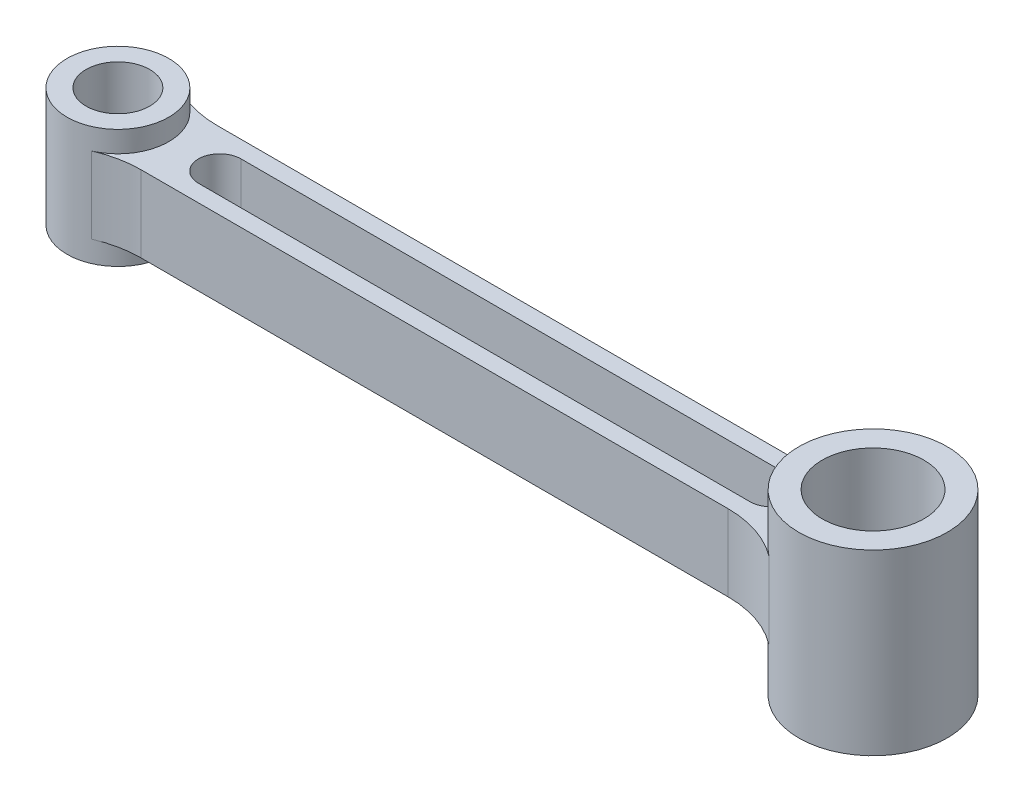
ISO-10303-21;
HEADER;
FILE_DESCRIPTION(('STEP AP214'),'2;1');
FILE_NAME('part.step','',(''),(''),'','','');
FILE_SCHEMA(('AUTOMOTIVE_DESIGN { 1 0 10303 214 1 1 1 1 }'));
ENDSEC;
DATA;
#1=APPLICATION_CONTEXT('core data for automotive mechanical design processes');
#2=APPLICATION_PROTOCOL_DEFINITION('international standard','automotive_design',2000,#1);
#3=PRODUCT_CONTEXT('',#1,'mechanical');
#4=PRODUCT('Part','Part','',(#3));
#5=PRODUCT_RELATED_PRODUCT_CATEGORY('part','',(#4));
#6=PRODUCT_DEFINITION_FORMATION('','',#4);
#7=PRODUCT_DEFINITION_CONTEXT('part definition',#1,'design');
#8=PRODUCT_DEFINITION('design','',#6,#7);
#9=PRODUCT_DEFINITION_SHAPE('','',#8);
#10=(LENGTH_UNIT() NAMED_UNIT(*) SI_UNIT(.MILLI.,.METRE.));
#11=(NAMED_UNIT(*) PLANE_ANGLE_UNIT() SI_UNIT($,.RADIAN.));
#12=(NAMED_UNIT(*) SI_UNIT($,.STERADIAN.) SOLID_ANGLE_UNIT());
#13=UNCERTAINTY_MEASURE_WITH_UNIT(LENGTH_MEASURE(1.E-05),#10,'distance_accuracy_value','');
#14=(GEOMETRIC_REPRESENTATION_CONTEXT(3) GLOBAL_UNCERTAINTY_ASSIGNED_CONTEXT((#13)) GLOBAL_UNIT_ASSIGNED_CONTEXT((#10,
#11,#12)) REPRESENTATION_CONTEXT('',''));
#15=CARTESIAN_POINT('',(0.,0.,0.));
#16=DIRECTION('',(0.,0.,1.));
#17=DIRECTION('',(1.,0.,0.));
#18=AXIS2_PLACEMENT_3D('',#15,#16,#17);
#19=CARTESIAN_POINT('',(-89.,14.,0.));
#20=DIRECTION('',(0.,-1.,0.));
#21=DIRECTION('',(0.,0.,-1.));
#22=AXIS2_PLACEMENT_3D('',#19,#20,#21);
#23=CYLINDRICAL_SURFACE('',#22,7.50000000000001);
#24=CARTESIAN_POINT('',(-89.,14.,0.));
#25=DIRECTION('',(0.,1.,0.));
#26=DIRECTION('',(0.,0.,1.));
#27=AXIS2_PLACEMENT_3D('',#24,#25,#26);
#28=CIRCLE('',#27,7.50000000000001);
#29=CARTESIAN_POINT('',(-89.,14.,7.50000000000001));
#30=VERTEX_POINT('',#29);
#31=EDGE_CURVE('E12',#30,#30,#28,.T.);
#32=ORIENTED_EDGE('',*,*,#31,.T.);
#33=EDGE_LOOP('',(#32));
#34=FACE_BOUND('',#33,.T.);
#35=CARTESIAN_POINT('',(-89.,-14.,0.));
#36=DIRECTION('',(0.,1.,0.));
#37=DIRECTION('',(0.,0.,1.));
#38=AXIS2_PLACEMENT_3D('',#35,#36,#37);
#39=CIRCLE('',#38,7.50000000000001);
#40=CARTESIAN_POINT('',(-89.,-14.,7.50000000000001));
#41=VERTEX_POINT('',#40);
#42=EDGE_CURVE('E60',#41,#41,#39,.T.);
#43=ORIENTED_EDGE('',*,*,#42,.F.);
#44=EDGE_LOOP('',(#43));
#45=FACE_BOUND('',#44,.T.);
#46=ADVANCED_FACE('F56',(#34,#45),#23,.F.);
#47=CARTESIAN_POINT('',(0.,-14.,0.));
#48=DIRECTION('',(0.,1.,0.));
#49=DIRECTION('',(0.,0.,1.));
#50=AXIS2_PLACEMENT_3D('',#47,#48,#49);
#51=PLANE('',#50);
#52=CARTESIAN_POINT('',(-89.,-14.,0.));
#53=DIRECTION('',(0.,1.,0.));
#54=DIRECTION('',(0.,0.,1.));
#55=AXIS2_PLACEMENT_3D('',#52,#53,#54);
#56=CIRCLE('',#55,12.);
#57=CARTESIAN_POINT('',(-89.,-14.,12.));
#58=VERTEX_POINT('',#57);
#59=EDGE_CURVE('E256',#58,#58,#56,.T.);
#60=ORIENTED_EDGE('',*,*,#59,.F.);
#61=EDGE_LOOP('',(#60));
#62=FACE_BOUND('',#61,.T.);
#63=ORIENTED_EDGE('',*,*,#42,.T.);
#64=EDGE_LOOP('',(#63));
#65=FACE_BOUND('',#64,.T.);
#66=ADVANCED_FACE('F264',(#62,#65),#51,.F.);
#67=CARTESIAN_POINT('',(-89.,14.,0.));
#68=DIRECTION('',(0.,-1.,0.));
#69=DIRECTION('',(0.,0.,-1.));
#70=AXIS2_PLACEMENT_3D('',#67,#68,#69);
#71=CYLINDRICAL_SURFACE('',#70,12.);
#72=DIRECTION('',(0.,-1.,0.));
#73=VECTOR('',#72,1.);
#74=CARTESIAN_POINT('',(-84.2041684766873,9.,11.));
#75=LINE('',#74,#73);
#76=CARTESIAN_POINT('',(-84.2041684766873,9.,11.));
#77=VERTEX_POINT('',#76);
#78=CARTESIAN_POINT('',(-84.2041684766873,-9.,11.));
#79=VERTEX_POINT('',#78);
#80=EDGE_CURVE('E253',#77,#79,#75,.T.);
#81=ORIENTED_EDGE('',*,*,#80,.F.);
#82=CARTESIAN_POINT('',(-89.,9.,0.));
#83=DIRECTION('',(0.,1.,0.));
#84=DIRECTION('',(0.,0.,1.));
#85=AXIS2_PLACEMENT_3D('',#82,#83,#84);
#86=CIRCLE('',#85,12.);
#87=CARTESIAN_POINT('',(-84.2041684766873,9.,-11.));
#88=VERTEX_POINT('',#87);
#89=EDGE_CURVE('E196',#77,#88,#86,.T.);
#90=ORIENTED_EDGE('',*,*,#89,.T.);
#91=DIRECTION('',(0.,-1.,0.));
#92=VECTOR('',#91,1.);
#93=CARTESIAN_POINT('',(-84.2041684766873,9.,-11.));
#94=LINE('',#93,#92);
#95=CARTESIAN_POINT('',(-84.2041684766873,-9.,-11.));
#96=VERTEX_POINT('',#95);
#97=EDGE_CURVE('E216',#88,#96,#94,.T.);
#98=ORIENTED_EDGE('',*,*,#97,.T.);
#99=CARTESIAN_POINT('',(-89.,-9.,0.));
#100=DIRECTION('',(0.,1.,0.));
#101=DIRECTION('',(0.,0.,1.));
#102=AXIS2_PLACEMENT_3D('',#99,#100,#101);
#103=CIRCLE('',#102,12.);
#104=EDGE_CURVE('E191',#79,#96,#103,.T.);
#105=ORIENTED_EDGE('',*,*,#104,.F.);
#106=EDGE_LOOP('',(#81,#90,#98,#105));
#107=FACE_BOUND('',#106,.T.);
#108=CARTESIAN_POINT('',(-89.,14.,0.));
#109=DIRECTION('',(0.,1.,0.));
#110=DIRECTION('',(0.,0.,1.));
#111=AXIS2_PLACEMENT_3D('',#108,#109,#110);
#112=CIRCLE('',#111,12.);
#113=CARTESIAN_POINT('',(-89.,14.,12.));
#114=VERTEX_POINT('',#113);
#115=EDGE_CURVE('E65',#114,#114,#112,.T.);
#116=ORIENTED_EDGE('',*,*,#115,.F.);
#117=EDGE_LOOP('',(#116));
#118=FACE_BOUND('',#117,.T.);
#119=ORIENTED_EDGE('',*,*,#59,.T.);
#120=EDGE_LOOP('',(#119));
#121=FACE_BOUND('',#120,.T.);
#122=ADVANCED_FACE('F58',(#107,#118,#121),#71,.T.);
#123=CARTESIAN_POINT('',(0.,14.,0.));
#124=DIRECTION('',(0.,1.,0.));
#125=DIRECTION('',(0.,0.,1.));
#126=AXIS2_PLACEMENT_3D('',#123,#124,#125);
#127=PLANE('',#126);
#128=ORIENTED_EDGE('',*,*,#115,.T.);
#129=EDGE_LOOP('',(#128));
#130=FACE_BOUND('',#129,.T.);
#131=ORIENTED_EDGE('',*,*,#31,.F.);
#132=EDGE_LOOP('',(#131));
#133=FACE_BOUND('',#132,.T.);
#134=ADVANCED_FACE('F274',(#130,#133),#127,.T.);
#135=CARTESIAN_POINT('',(-74.6125054300618,9.,33.));
#136=DIRECTION('',(0.,-1.,0.));
#137=DIRECTION('',(0.,0.,-1.));
#138=AXIS2_PLACEMENT_3D('',#135,#136,#137);
#139=CYLINDRICAL_SURFACE('',#138,24.);
#140=CARTESIAN_POINT('',(-74.6125054300618,-9.,33.));
#141=DIRECTION('',(0.,1.,0.));
#142=DIRECTION('',(0.,0.,1.));
#143=AXIS2_PLACEMENT_3D('',#140,#141,#142);
#144=CIRCLE('',#143,24.);
#145=CARTESIAN_POINT('',(-74.6125054300618,-9.,9.));
#146=VERTEX_POINT('',#145);
#147=EDGE_CURVE('E219',#79,#146,#144,.F.);
#148=ORIENTED_EDGE('',*,*,#147,.T.);
#149=DIRECTION('',(0.,-1.,0.));
#150=VECTOR('',#149,1.);
#151=CARTESIAN_POINT('',(-74.6125054300618,9.,9.));
#152=LINE('',#151,#150);
#153=CARTESIAN_POINT('',(-74.6125054300618,9.,9.));
#154=VERTEX_POINT('',#153);
#155=EDGE_CURVE('E250',#154,#146,#152,.T.);
#156=ORIENTED_EDGE('',*,*,#155,.F.);
#157=CARTESIAN_POINT('',(-74.6125054300618,9.,33.));
#158=DIRECTION('',(0.,1.,0.));
#159=DIRECTION('',(0.,0.,1.));
#160=AXIS2_PLACEMENT_3D('',#157,#158,#159);
#161=CIRCLE('',#160,24.);
#162=EDGE_CURVE('E198',#77,#154,#161,.F.);
#163=ORIENTED_EDGE('',*,*,#162,.F.);
#164=ORIENTED_EDGE('',*,*,#80,.T.);
#165=EDGE_LOOP('',(#148,#156,#163,#164));
#166=FACE_BOUND('',#165,.T.);
#167=ADVANCED_FACE('F279',(#166),#139,.F.);
#168=CARTESIAN_POINT('',(0.,9.,9.));
#169=DIRECTION('',(0.,0.,-1.));
#170=DIRECTION('',(-1.,0.,0.));
#171=AXIS2_PLACEMENT_3D('',#168,#169,#170);
#172=PLANE('',#171);
#173=DIRECTION('',(1.,0.,0.));
#174=VECTOR('',#173,1.);
#175=CARTESIAN_POINT('',(0.,-9.,9.));
#176=LINE('',#175,#174);
#177=CARTESIAN_POINT('',(63.8355409356768,-9.,9.));
#178=VERTEX_POINT('',#177);
#179=EDGE_CURVE('E221',#146,#178,#176,.T.);
#180=ORIENTED_EDGE('',*,*,#179,.T.);
#181=DIRECTION('',(0.,-1.,0.));
#182=VECTOR('',#181,1.);
#183=CARTESIAN_POINT('',(63.8355409356768,9.,9.));
#184=LINE('',#183,#182);
#185=CARTESIAN_POINT('',(63.8355409356768,9.,9.));
#186=VERTEX_POINT('',#185);
#187=EDGE_CURVE('E248',#186,#178,#184,.T.);
#188=ORIENTED_EDGE('',*,*,#187,.F.);
#189=DIRECTION('',(1.,0.,0.));
#190=VECTOR('',#189,1.);
#191=CARTESIAN_POINT('',(0.,9.,9.));
#192=LINE('',#191,#190);
#193=EDGE_CURVE('E201',#154,#186,#192,.T.);
#194=ORIENTED_EDGE('',*,*,#193,.F.);
#195=ORIENTED_EDGE('',*,*,#155,.T.);
#196=EDGE_LOOP('',(#180,#188,#194,#195));
#197=FACE_BOUND('',#196,.T.);
#198=ADVANCED_FACE('F303',(#197),#172,.F.);
#199=CARTESIAN_POINT('',(63.8355409356768,9.,33.));
#200=DIRECTION('',(0.,-1.,0.));
#201=DIRECTION('',(0.,0.,-1.));
#202=AXIS2_PLACEMENT_3D('',#199,#200,#201);
#203=CYLINDRICAL_SURFACE('',#202,24.);
#204=CARTESIAN_POINT('',(63.8355409356768,-9.,33.));
#205=DIRECTION('',(0.,1.,0.));
#206=DIRECTION('',(0.,0.,1.));
#207=AXIS2_PLACEMENT_3D('',#204,#205,#206);
#208=CIRCLE('',#207,24.);
#209=CARTESIAN_POINT('',(78.3884811174541,-9.,13.9156626506024));
#210=VERTEX_POINT('',#209);
#211=EDGE_CURVE('E224',#210,#178,#208,.T.);
#212=ORIENTED_EDGE('',*,*,#211,.F.);
#213=DIRECTION('',(0.,-1.,0.));
#214=VECTOR('',#213,1.);
#215=CARTESIAN_POINT('',(78.3884811174541,9.,13.9156626506024));
#216=LINE('',#215,#214);
#217=CARTESIAN_POINT('',(78.3884811174541,9.,13.9156626506024));
#218=VERTEX_POINT('',#217);
#219=EDGE_CURVE('E246',#218,#210,#216,.T.);
#220=ORIENTED_EDGE('',*,*,#219,.F.);
#221=CARTESIAN_POINT('',(63.8355409356768,9.,33.));
#222=DIRECTION('',(0.,1.,0.));
#223=DIRECTION('',(0.,0.,1.));
#224=AXIS2_PLACEMENT_3D('',#221,#222,#223);
#225=CIRCLE('',#224,24.);
#226=EDGE_CURVE('E203',#218,#186,#225,.T.);
#227=ORIENTED_EDGE('',*,*,#226,.T.);
#228=ORIENTED_EDGE('',*,*,#187,.T.);
#229=EDGE_LOOP('',(#212,#220,#227,#228));
#230=FACE_BOUND('',#229,.T.);
#231=ADVANCED_FACE('F310',(#230),#203,.F.);
#232=CARTESIAN_POINT('',(63.8355409356768,9.,-33.));
#233=DIRECTION('',(0.,-1.,0.));
#234=DIRECTION('',(0.,0.,-1.));
#235=AXIS2_PLACEMENT_3D('',#232,#233,#234);
#236=CYLINDRICAL_SURFACE('',#235,24.);
#237=CARTESIAN_POINT('',(63.8355409356768,-9.,-33.));
#238=DIRECTION('',(0.,1.,0.));
#239=DIRECTION('',(0.,0.,1.));
#240=AXIS2_PLACEMENT_3D('',#237,#238,#239);
#241=CIRCLE('',#240,24.);
#242=CARTESIAN_POINT('',(78.3884811174541,-9.,-13.9156626506024));
#243=VERTEX_POINT('',#242);
#244=CARTESIAN_POINT('',(63.8355409356768,-9.,-9.));
#245=VERTEX_POINT('',#244);
#246=EDGE_CURVE('E230',#243,#245,#241,.F.);
#247=ORIENTED_EDGE('',*,*,#246,.T.);
#248=DIRECTION('',(0.,-1.,0.));
#249=VECTOR('',#248,1.);
#250=CARTESIAN_POINT('',(63.8355409356768,9.,-9.));
#251=LINE('',#250,#249);
#252=CARTESIAN_POINT('',(63.8355409356768,9.,-9.));
#253=VERTEX_POINT('',#252);
#254=EDGE_CURVE('E241',#253,#245,#251,.T.);
#255=ORIENTED_EDGE('',*,*,#254,.F.);
#256=CARTESIAN_POINT('',(63.8355409356768,9.,-33.));
#257=DIRECTION('',(0.,1.,0.));
#258=DIRECTION('',(0.,0.,1.));
#259=AXIS2_PLACEMENT_3D('',#256,#257,#258);
#260=CIRCLE('',#259,24.);
#261=CARTESIAN_POINT('',(78.3884811174541,9.,-13.9156626506024));
#262=VERTEX_POINT('',#261);
#263=EDGE_CURVE('E208',#262,#253,#260,.F.);
#264=ORIENTED_EDGE('',*,*,#263,.F.);
#265=DIRECTION('',(0.,-1.,0.));
#266=VECTOR('',#265,1.);
#267=CARTESIAN_POINT('',(78.3884811174541,9.,-13.9156626506024));
#268=LINE('',#267,#266);
#269=EDGE_CURVE('E243',#262,#243,#268,.T.);
#270=ORIENTED_EDGE('',*,*,#269,.T.);
#271=EDGE_LOOP('',(#247,#255,#264,#270));
#272=FACE_BOUND('',#271,.T.);
#273=ADVANCED_FACE('F318',(#272),#236,.F.);
#274=CARTESIAN_POINT('',(0.,9.,-9.));
#275=DIRECTION('',(0.,0.,-1.));
#276=DIRECTION('',(-1.,0.,0.));
#277=AXIS2_PLACEMENT_3D('',#274,#275,#276);
#278=PLANE('',#277);
#279=DIRECTION('',(1.,0.,0.));
#280=VECTOR('',#279,1.);
#281=CARTESIAN_POINT('',(0.,-9.,-9.));
#282=LINE('',#281,#280);
#283=CARTESIAN_POINT('',(-74.6125054300618,-9.,-9.));
#284=VERTEX_POINT('',#283);
#285=EDGE_CURVE('E233',#284,#245,#282,.T.);
#286=ORIENTED_EDGE('',*,*,#285,.F.);
#287=DIRECTION('',(0.,-1.,0.));
#288=VECTOR('',#287,1.);
#289=CARTESIAN_POINT('',(-74.6125054300618,9.,-9.));
#290=LINE('',#289,#288);
#291=CARTESIAN_POINT('',(-74.6125054300618,9.,-9.));
#292=VERTEX_POINT('',#291);
#293=EDGE_CURVE('E239',#292,#284,#290,.T.);
#294=ORIENTED_EDGE('',*,*,#293,.F.);
#295=DIRECTION('',(1.,0.,0.));
#296=VECTOR('',#295,1.);
#297=CARTESIAN_POINT('',(0.,9.,-9.));
#298=LINE('',#297,#296);
#299=EDGE_CURVE('E210',#292,#253,#298,.T.);
#300=ORIENTED_EDGE('',*,*,#299,.T.);
#301=ORIENTED_EDGE('',*,*,#254,.T.);
#302=EDGE_LOOP('',(#286,#294,#300,#301));
#303=FACE_BOUND('',#302,.T.);
#304=ADVANCED_FACE('F320',(#303),#278,.T.);
#305=CARTESIAN_POINT('',(-74.6125054300618,9.,-33.));
#306=DIRECTION('',(0.,-1.,0.));
#307=DIRECTION('',(0.,0.,-1.));
#308=AXIS2_PLACEMENT_3D('',#305,#306,#307);
#309=CYLINDRICAL_SURFACE('',#308,24.);
#310=CARTESIAN_POINT('',(-74.6125054300618,-9.,-33.));
#311=DIRECTION('',(0.,1.,0.));
#312=DIRECTION('',(0.,0.,1.));
#313=AXIS2_PLACEMENT_3D('',#310,#311,#312);
#314=CIRCLE('',#313,24.);
#315=EDGE_CURVE('E199',#96,#284,#314,.T.);
#316=ORIENTED_EDGE('',*,*,#315,.F.);
#317=ORIENTED_EDGE('',*,*,#97,.F.);
#318=CARTESIAN_POINT('',(-74.6125054300618,9.,-33.));
#319=DIRECTION('',(0.,1.,0.));
#320=DIRECTION('',(0.,0.,1.));
#321=AXIS2_PLACEMENT_3D('',#318,#319,#320);
#322=CIRCLE('',#321,24.);
#323=EDGE_CURVE('E213',#88,#292,#322,.T.);
#324=ORIENTED_EDGE('',*,*,#323,.T.);
#325=ORIENTED_EDGE('',*,*,#293,.T.);
#326=EDGE_LOOP('',(#316,#317,#324,#325));
#327=FACE_BOUND('',#326,.T.);
#328=ADVANCED_FACE('F299',(#327),#309,.F.);
#329=CARTESIAN_POINT('',(0.,9.,0.));
#330=DIRECTION('',(0.,1.,0.));
#331=DIRECTION('',(0.,0.,1.));
#332=AXIS2_PLACEMENT_3D('',#329,#330,#331);
#333=PLANE('',#332);
#334=CARTESIAN_POINT('',(-65.,9.,0.));
#335=DIRECTION('',(0.,1.,0.));
#336=DIRECTION('',(0.,0.,1.));
#337=AXIS2_PLACEMENT_3D('',#334,#335,#336);
#338=CIRCLE('',#337,5.);
#339=CARTESIAN_POINT('',(-65.,9.,-5.));
#340=VERTEX_POINT('',#339);
#341=CARTESIAN_POINT('',(-65.,9.,5.));
#342=VERTEX_POINT('',#341);
#343=EDGE_CURVE('E73',#340,#342,#338,.T.);
#344=ORIENTED_EDGE('',*,*,#343,.F.);
#345=DIRECTION('',(-1.,0.,0.));
#346=VECTOR('',#345,1.);
#347=CARTESIAN_POINT('',(-65.,9.,-5.));
#348=LINE('',#347,#346);
#349=CARTESIAN_POINT('',(65.,9.,-5.));
#350=VERTEX_POINT('',#349);
#351=EDGE_CURVE('E155',#350,#340,#348,.T.);
#352=ORIENTED_EDGE('',*,*,#351,.F.);
#353=CARTESIAN_POINT('',(65.,9.,0.));
#354=DIRECTION('',(0.,1.,0.));
#355=DIRECTION('',(0.,0.,1.));
#356=AXIS2_PLACEMENT_3D('',#353,#354,#355);
#357=CIRCLE('',#356,5.);
#358=CARTESIAN_POINT('',(65.,9.,5.));
#359=VERTEX_POINT('',#358);
#360=EDGE_CURVE('E175',#359,#350,#357,.T.);
#361=ORIENTED_EDGE('',*,*,#360,.F.);
#362=DIRECTION('',(1.,0.,0.));
#363=VECTOR('',#362,1.);
#364=CARTESIAN_POINT('',(-65.,9.,5.));
#365=LINE('',#364,#363);
#366=EDGE_CURVE('E169',#342,#359,#365,.T.);
#367=ORIENTED_EDGE('',*,*,#366,.F.);
#368=EDGE_LOOP('',(#344,#352,#361,#367));
#369=FACE_BOUND('',#368,.T.);
#370=ORIENTED_EDGE('',*,*,#89,.F.);
#371=ORIENTED_EDGE('',*,*,#162,.T.);
#372=ORIENTED_EDGE('',*,*,#193,.T.);
#373=ORIENTED_EDGE('',*,*,#226,.F.);
#374=CARTESIAN_POINT('',(89.,9.,0.));
#375=DIRECTION('',(0.,1.,0.));
#376=DIRECTION('',(0.,0.,1.));
#377=AXIS2_PLACEMENT_3D('',#374,#375,#376);
#378=CIRCLE('',#377,17.5);
#379=EDGE_CURVE('E206',#262,#218,#378,.T.);
#380=ORIENTED_EDGE('',*,*,#379,.F.);
#381=ORIENTED_EDGE('',*,*,#263,.T.);
#382=ORIENTED_EDGE('',*,*,#299,.F.);
#383=ORIENTED_EDGE('',*,*,#323,.F.);
#384=EDGE_LOOP('',(#370,#371,#372,#373,#380,#381,#382,#383));
#385=FACE_BOUND('',#384,.T.);
#386=ADVANCED_FACE('F295',(#369,#385),#333,.T.);
#387=CARTESIAN_POINT('',(0.,-9.,0.));
#388=DIRECTION('',(0.,1.,0.));
#389=DIRECTION('',(0.,0.,1.));
#390=AXIS2_PLACEMENT_3D('',#387,#388,#389);
#391=PLANE('',#390);
#392=DIRECTION('',(1.,0.,0.));
#393=VECTOR('',#392,1.);
#394=CARTESIAN_POINT('',(-65.,-9.,-5.));
#395=LINE('',#394,#393);
#396=CARTESIAN_POINT('',(-65.,-9.,-5.));
#397=VERTEX_POINT('',#396);
#398=CARTESIAN_POINT('',(65.,-9.,-5.));
#399=VERTEX_POINT('',#398);
#400=EDGE_CURVE('E167',#397,#399,#395,.T.);
#401=ORIENTED_EDGE('',*,*,#400,.F.);
#402=CARTESIAN_POINT('',(-65.,-9.,0.));
#403=DIRECTION('',(0.,1.,0.));
#404=DIRECTION('',(0.,0.,1.));
#405=AXIS2_PLACEMENT_3D('',#402,#403,#404);
#406=CIRCLE('',#405,5.);
#407=CARTESIAN_POINT('',(-65.,-9.,5.));
#408=VERTEX_POINT('',#407);
#409=EDGE_CURVE('E149',#408,#397,#406,.F.);
#410=ORIENTED_EDGE('',*,*,#409,.F.);
#411=DIRECTION('',(-1.,0.,0.));
#412=VECTOR('',#411,1.);
#413=CARTESIAN_POINT('',(-65.,-9.,5.));
#414=LINE('',#413,#412);
#415=CARTESIAN_POINT('',(65.,-9.,5.));
#416=VERTEX_POINT('',#415);
#417=EDGE_CURVE('E158',#416,#408,#414,.T.);
#418=ORIENTED_EDGE('',*,*,#417,.F.);
#419=CARTESIAN_POINT('',(65.,-9.,0.));
#420=DIRECTION('',(0.,1.,0.));
#421=DIRECTION('',(0.,0.,1.));
#422=AXIS2_PLACEMENT_3D('',#419,#420,#421);
#423=CIRCLE('',#422,5.);
#424=EDGE_CURVE('E81',#399,#416,#423,.F.);
#425=ORIENTED_EDGE('',*,*,#424,.F.);
#426=EDGE_LOOP('',(#401,#410,#418,#425));
#427=FACE_BOUND('',#426,.T.);
#428=ORIENTED_EDGE('',*,*,#104,.T.);
#429=ORIENTED_EDGE('',*,*,#315,.T.);
#430=ORIENTED_EDGE('',*,*,#285,.T.);
#431=ORIENTED_EDGE('',*,*,#246,.F.);
#432=CARTESIAN_POINT('',(89.,-9.,0.));
#433=DIRECTION('',(0.,1.,0.));
#434=DIRECTION('',(0.,0.,1.));
#435=AXIS2_PLACEMENT_3D('',#432,#433,#434);
#436=CIRCLE('',#435,17.5);
#437=EDGE_CURVE('E227',#243,#210,#436,.T.);
#438=ORIENTED_EDGE('',*,*,#437,.T.);
#439=ORIENTED_EDGE('',*,*,#211,.T.);
#440=ORIENTED_EDGE('',*,*,#179,.F.);
#441=ORIENTED_EDGE('',*,*,#147,.F.);
#442=EDGE_LOOP('',(#428,#429,#430,#431,#438,#439,#440,#441));
#443=FACE_BOUND('',#442,.T.);
#444=ADVANCED_FACE('F164',(#427,#443),#391,.F.);
#445=CARTESIAN_POINT('',(89.,21.,0.));
#446=DIRECTION('',(0.,-1.,0.));
#447=DIRECTION('',(0.,0.,-1.));
#448=AXIS2_PLACEMENT_3D('',#445,#446,#447);
#449=CYLINDRICAL_SURFACE('',#448,12.);
#450=CARTESIAN_POINT('',(89.,21.,0.));
#451=DIRECTION('',(0.,1.,0.));
#452=DIRECTION('',(0.,0.,1.));
#453=AXIS2_PLACEMENT_3D('',#450,#451,#452);
#454=CIRCLE('',#453,12.);
#455=CARTESIAN_POINT('',(89.,21.,-12.));
#456=VERTEX_POINT('',#455);
#457=EDGE_CURVE('E184',#456,#456,#454,.T.);
#458=CARTESIAN_POINT('',(89.,-21.,0.));
#459=DIRECTION('',(0.,1.,0.));
#460=DIRECTION('',(0.,0.,1.));
#461=AXIS2_PLACEMENT_3D('',#458,#459,#460);
#462=CIRCLE('',#461,12.);
#463=CARTESIAN_POINT('',(89.,-21.,-12.));
#464=VERTEX_POINT('',#463);
#465=EDGE_CURVE('E161',#464,#464,#462,.T.);
#466=CARTESIAN_POINT('',(89.,21.,-12.));
#467=CARTESIAN_POINT('',(89.,20.5625,-12.));
#468=CARTESIAN_POINT('',(89.,20.125,-12.));
#469=CARTESIAN_POINT('',(89.,19.25,-12.));
#470=CARTESIAN_POINT('',(89.,18.8125,-12.));
#471=CARTESIAN_POINT('',(89.,17.9375,-12.));
#472=CARTESIAN_POINT('',(89.,17.5,-12.));
#473=CARTESIAN_POINT('',(89.,16.625,-12.));
#474=CARTESIAN_POINT('',(89.,16.1875,-12.));
#475=CARTESIAN_POINT('',(89.,15.3125,-12.));
#476=CARTESIAN_POINT('',(89.,14.875,-12.));
#477=CARTESIAN_POINT('',(89.,14.,-12.));
#478=CARTESIAN_POINT('',(89.,13.5625,-12.));
#479=CARTESIAN_POINT('',(89.,12.6875,-12.));
#480=CARTESIAN_POINT('',(89.,12.25,-12.));
#481=CARTESIAN_POINT('',(89.,11.375,-12.));
#482=CARTESIAN_POINT('',(89.,10.9375,-12.));
#483=CARTESIAN_POINT('',(89.,10.0625,-12.));
#484=CARTESIAN_POINT('',(89.,9.625,-12.));
#485=CARTESIAN_POINT('',(89.,8.75,-12.));
#486=CARTESIAN_POINT('',(89.,8.3125,-12.));
#487=CARTESIAN_POINT('',(89.,7.4375,-12.));
#488=CARTESIAN_POINT('',(89.,7.,-12.));
#489=CARTESIAN_POINT('',(89.,6.125,-12.));
#490=CARTESIAN_POINT('',(89.,5.6875,-12.));
#491=CARTESIAN_POINT('',(89.,4.8125,-12.));
#492=CARTESIAN_POINT('',(89.,4.375,-12.));
#493=CARTESIAN_POINT('',(89.,3.5,-12.));
#494=CARTESIAN_POINT('',(89.,3.0625,-12.));
#495=CARTESIAN_POINT('',(89.,2.1875,-12.));
#496=CARTESIAN_POINT('',(89.,1.75,-12.));
#497=CARTESIAN_POINT('',(89.,0.874999999999997,-12.));
#498=CARTESIAN_POINT('',(89.,0.437499999999997,-12.));
#499=CARTESIAN_POINT('',(89.,-0.437500000000004,-12.));
#500=CARTESIAN_POINT('',(89.,-0.875000000000004,-12.));
#501=CARTESIAN_POINT('',(89.,-1.75000000000001,-12.));
#502=CARTESIAN_POINT('',(89.,-2.18750000000001,-12.));
#503=CARTESIAN_POINT('',(89.,-3.0625,-12.));
#504=CARTESIAN_POINT('',(89.,-3.5,-12.));
#505=CARTESIAN_POINT('',(89.,-4.375,-12.));
#506=CARTESIAN_POINT('',(89.,-4.8125,-12.));
#507=CARTESIAN_POINT('',(89.,-5.68750000000001,-12.));
#508=CARTESIAN_POINT('',(89.,-6.12500000000001,-12.));
#509=CARTESIAN_POINT('',(89.,-7.00000000000001,-12.));
#510=CARTESIAN_POINT('',(89.,-7.4375,-12.));
#511=CARTESIAN_POINT('',(89.,-8.3125,-12.));
#512=CARTESIAN_POINT('',(89.,-8.75,-12.));
#513=CARTESIAN_POINT('',(89.,-9.625,-12.));
#514=CARTESIAN_POINT('',(89.,-10.0625,-12.));
#515=CARTESIAN_POINT('',(89.,-10.9375,-12.));
#516=CARTESIAN_POINT('',(89.,-11.375,-12.));
#517=CARTESIAN_POINT('',(89.,-12.25,-12.));
#518=CARTESIAN_POINT('',(89.,-12.6875,-12.));
#519=CARTESIAN_POINT('',(89.,-13.5625,-12.));
#520=CARTESIAN_POINT('',(89.,-14.,-12.));
#521=CARTESIAN_POINT('',(89.,-14.875,-12.));
#522=CARTESIAN_POINT('',(89.,-15.3125,-12.));
#523=CARTESIAN_POINT('',(89.,-16.1875,-12.));
#524=CARTESIAN_POINT('',(89.,-16.625,-12.));
#525=CARTESIAN_POINT('',(89.,-17.5,-12.));
#526=CARTESIAN_POINT('',(89.,-17.9375,-12.));
#527=CARTESIAN_POINT('',(89.,-18.8125,-12.));
#528=CARTESIAN_POINT('',(89.,-19.25,-12.));
#529=CARTESIAN_POINT('',(89.,-20.125,-12.));
#530=CARTESIAN_POINT('',(89.,-20.5625,-12.));
#531=CARTESIAN_POINT('',(89.,-21.,-12.));
#532=B_SPLINE_CURVE_WITH_KNOTS('',3,(#466,#467,#468,#469,#470,#471,#472,#473,#474,#475,#476,
#477,#478,#479,#480,#481,#482,#483,#484,#485,#486,#487,#488,#489,#490,#491,#492,#493,#494,#495,
#496,#497,#498,#499,#500,#501,#502,#503,#504,#505,#506,#507,#508,#509,#510,#511,#512,#513,#514,
#515,#516,#517,#518,#519,#520,#521,#522,#523,#524,#525,#526,#527,#528,#529,#530,#531),
.UNSPECIFIED.,.F.,.F.,(4,2,2,2,2,2,2,2,2,2,2,2,2,2,2,2,2,2,2,2,2,2,2,2,2,2,2,2,2,2,2,2,4),(0.,
1.3125,2.625,3.9375,5.25,6.5625,7.875,9.1875,10.5,11.8125,13.125,14.4375,15.75,17.0625,18.375,
19.6875,21.,22.3125,23.625,24.9375,26.25,27.5625,28.875,30.1875,31.5,32.8125,34.125,35.4375,
36.75,38.0625,39.375,40.6875,42.),.UNSPECIFIED.);
#533=EDGE_CURVE('BSEAM372',#456,#464,#532,.T.);
#534=ORIENTED_EDGE('',*,*,#457,.T.);
#535=ORIENTED_EDGE('',*,*,#465,.F.);
#536=ORIENTED_EDGE('',*,*,#533,.T.);
#537=ORIENTED_EDGE('',*,*,#533,.F.);
#538=EDGE_LOOP('',(#534,#536,#535,#537));
#539=FACE_BOUND('',#538,.T.);
#540=ADVANCED_FACE('F372',(#539),#449,.F.);
#541=CARTESIAN_POINT('',(89.,21.,0.));
#542=DIRECTION('',(0.,-1.,0.));
#543=DIRECTION('',(0.,0.,-1.));
#544=AXIS2_PLACEMENT_3D('',#541,#542,#543);
#545=CYLINDRICAL_SURFACE('',#544,17.5);
#546=ORIENTED_EDGE('',*,*,#379,.T.);
#547=ORIENTED_EDGE('',*,*,#219,.T.);
#548=ORIENTED_EDGE('',*,*,#437,.F.);
#549=ORIENTED_EDGE('',*,*,#269,.F.);
#550=EDGE_LOOP('',(#546,#547,#548,#549));
#551=FACE_BOUND('',#550,.T.);
#552=CARTESIAN_POINT('',(89.,21.,0.));
#553=DIRECTION('',(0.,1.,0.));
#554=DIRECTION('',(0.,0.,1.));
#555=AXIS2_PLACEMENT_3D('',#552,#553,#554);
#556=CIRCLE('',#555,17.5);
#557=CARTESIAN_POINT('',(89.,21.,17.5));
#558=VERTEX_POINT('',#557);
#559=EDGE_CURVE('E187',#558,#558,#556,.T.);
#560=ORIENTED_EDGE('',*,*,#559,.F.);
#561=EDGE_LOOP('',(#560));
#562=FACE_BOUND('',#561,.T.);
#563=CARTESIAN_POINT('',(89.,-21.,0.));
#564=DIRECTION('',(0.,1.,0.));
#565=DIRECTION('',(0.,0.,1.));
#566=AXIS2_PLACEMENT_3D('',#563,#564,#565);
#567=CIRCLE('',#566,17.5);
#568=CARTESIAN_POINT('',(89.,-21.,17.5));
#569=VERTEX_POINT('',#568);
#570=EDGE_CURVE('E188',#569,#569,#567,.T.);
#571=ORIENTED_EDGE('',*,*,#570,.T.);
#572=EDGE_LOOP('',(#571));
#573=FACE_BOUND('',#572,.T.);
#574=ADVANCED_FACE('F312',(#551,#562,#573),#545,.T.);
#575=CARTESIAN_POINT('',(0.,21.,0.));
#576=DIRECTION('',(0.,1.,0.));
#577=DIRECTION('',(0.,0.,1.));
#578=AXIS2_PLACEMENT_3D('',#575,#576,#577);
#579=PLANE('',#578);
#580=ORIENTED_EDGE('',*,*,#457,.F.);
#581=EDGE_LOOP('',(#580));
#582=FACE_BOUND('',#581,.T.);
#583=ORIENTED_EDGE('',*,*,#559,.T.);
#584=EDGE_LOOP('',(#583));
#585=FACE_BOUND('',#584,.T.);
#586=ADVANCED_FACE('F388',(#582,#585),#579,.T.);
#587=CARTESIAN_POINT('',(0.,-21.,0.));
#588=DIRECTION('',(0.,1.,0.));
#589=DIRECTION('',(0.,0.,1.));
#590=AXIS2_PLACEMENT_3D('',#587,#588,#589);
#591=PLANE('',#590);
#592=ORIENTED_EDGE('',*,*,#465,.T.);
#593=EDGE_LOOP('',(#592));
#594=FACE_BOUND('',#593,.T.);
#595=ORIENTED_EDGE('',*,*,#570,.F.);
#596=EDGE_LOOP('',(#595));
#597=FACE_BOUND('',#596,.T.);
#598=ADVANCED_FACE('F397',(#594,#597),#591,.F.);
#599=CARTESIAN_POINT('',(-65.,-21.001,0.));
#600=DIRECTION('',(0.,1.,0.));
#601=DIRECTION('',(0.,0.,1.));
#602=AXIS2_PLACEMENT_3D('',#599,#600,#601);
#603=CYLINDRICAL_SURFACE('',#602,5.);
#604=ORIENTED_EDGE('',*,*,#409,.T.);
#605=DIRECTION('',(0.,1.,0.));
#606=VECTOR('',#605,1.);
#607=CARTESIAN_POINT('',(-65.,-21.001,-5.));
#608=LINE('',#607,#606);
#609=EDGE_CURVE('E162',#397,#340,#608,.T.);
#610=ORIENTED_EDGE('',*,*,#609,.T.);
#611=ORIENTED_EDGE('',*,*,#343,.T.);
#612=DIRECTION('',(0.,1.,0.));
#613=VECTOR('',#612,1.);
#614=CARTESIAN_POINT('',(-65.,-21.001,5.));
#615=LINE('',#614,#613);
#616=EDGE_CURVE('E145',#408,#342,#615,.T.);
#617=ORIENTED_EDGE('',*,*,#616,.F.);
#618=EDGE_LOOP('',(#604,#610,#611,#617));
#619=FACE_BOUND('',#618,.T.);
#620=ADVANCED_FACE('F147',(#619),#603,.F.);
#621=CARTESIAN_POINT('',(-65.,-21.001,-5.));
#622=DIRECTION('',(0.,0.,-1.));
#623=DIRECTION('',(-1.,0.,0.));
#624=AXIS2_PLACEMENT_3D('',#621,#622,#623);
#625=PLANE('',#624);
#626=ORIENTED_EDGE('',*,*,#400,.T.);
#627=DIRECTION('',(0.,1.,0.));
#628=VECTOR('',#627,1.);
#629=CARTESIAN_POINT('',(65.,-21.001,-5.));
#630=LINE('',#629,#628);
#631=EDGE_CURVE('E181',#399,#350,#630,.T.);
#632=ORIENTED_EDGE('',*,*,#631,.T.);
#633=ORIENTED_EDGE('',*,*,#351,.T.);
#634=ORIENTED_EDGE('',*,*,#609,.F.);
#635=EDGE_LOOP('',(#626,#632,#633,#634));
#636=FACE_BOUND('',#635,.T.);
#637=ADVANCED_FACE('F432',(#636),#625,.F.);
#638=CARTESIAN_POINT('',(65.,-21.001,0.));
#639=DIRECTION('',(0.,1.,0.));
#640=DIRECTION('',(0.,0.,1.));
#641=AXIS2_PLACEMENT_3D('',#638,#639,#640);
#642=CYLINDRICAL_SURFACE('',#641,5.);
#643=ORIENTED_EDGE('',*,*,#424,.T.);
#644=DIRECTION('',(0.,1.,0.));
#645=VECTOR('',#644,1.);
#646=CARTESIAN_POINT('',(65.,-21.001,5.));
#647=LINE('',#646,#645);
#648=EDGE_CURVE('E154',#416,#359,#647,.T.);
#649=ORIENTED_EDGE('',*,*,#648,.T.);
#650=ORIENTED_EDGE('',*,*,#360,.T.);
#651=ORIENTED_EDGE('',*,*,#631,.F.);
#652=EDGE_LOOP('',(#643,#649,#650,#651));
#653=FACE_BOUND('',#652,.T.);
#654=ADVANCED_FACE('F442',(#653),#642,.F.);
#655=CARTESIAN_POINT('',(-65.,-21.001,5.));
#656=DIRECTION('',(0.,0.,1.));
#657=DIRECTION('',(1.,0.,0.));
#658=AXIS2_PLACEMENT_3D('',#655,#656,#657);
#659=PLANE('',#658);
#660=ORIENTED_EDGE('',*,*,#417,.T.);
#661=ORIENTED_EDGE('',*,*,#616,.T.);
#662=ORIENTED_EDGE('',*,*,#366,.T.);
#663=ORIENTED_EDGE('',*,*,#648,.F.);
#664=EDGE_LOOP('',(#660,#661,#662,#663));
#665=FACE_BOUND('',#664,.T.);
#666=ADVANCED_FACE('F159',(#665),#659,.F.);
#667=CLOSED_SHELL('',(#46,#66,#122,#134,#167,#198,#231,#273,#304,#328,#386,#444,#540,#574,#586,
#598,#620,#637,#654,#666));
#668=MANIFOLD_SOLID_BREP('B2',#667);
#669=ADVANCED_BREP_SHAPE_REPRESENTATION('',(#18,#668),#14);
#670=SHAPE_DEFINITION_REPRESENTATION(#9,#669);
ENDSEC;
END-ISO-10303-21;
